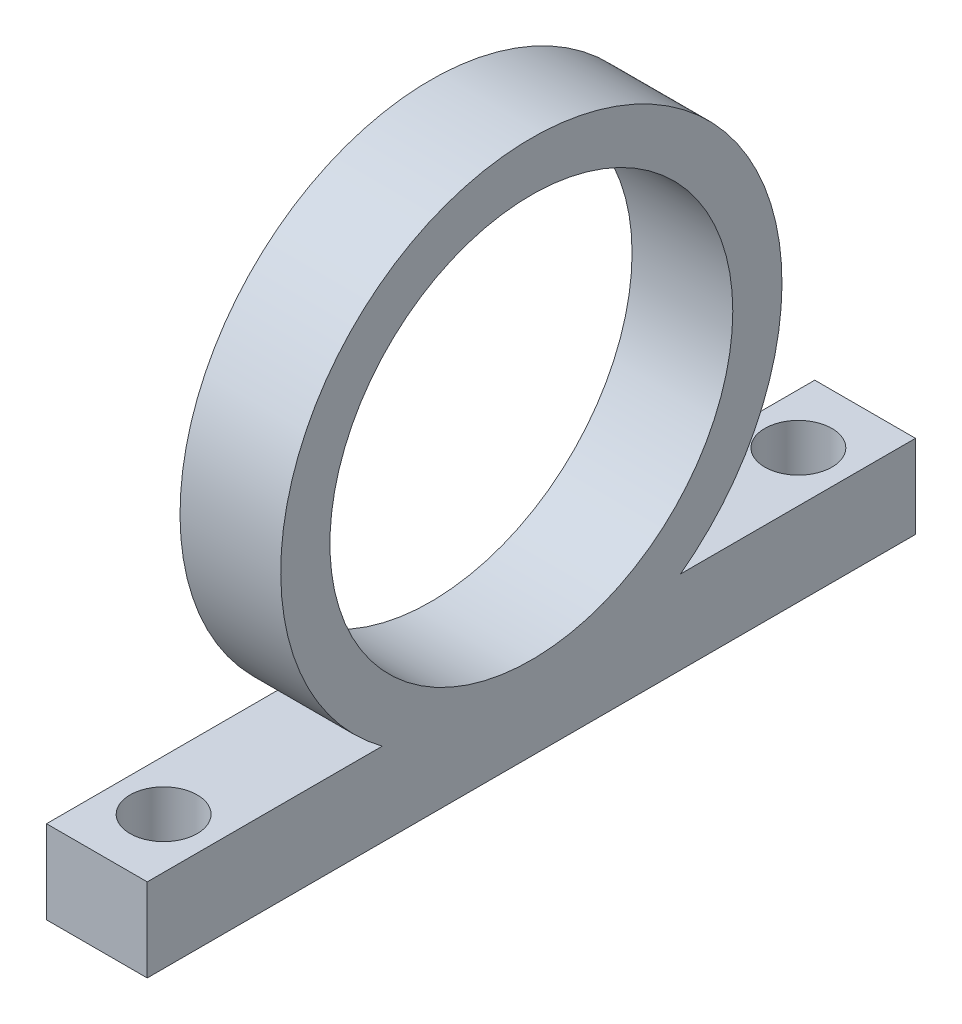
ISO-10303-21;
HEADER;
FILE_DESCRIPTION(('STEP AP214'),'2;1');
FILE_NAME('part.step','',(''),(''),'','','');
FILE_SCHEMA(('AUTOMOTIVE_DESIGN { 1 0 10303 214 1 1 1 1 }'));
ENDSEC;
DATA;
#1=APPLICATION_CONTEXT('core data for automotive mechanical design processes');
#2=APPLICATION_PROTOCOL_DEFINITION('international standard','automotive_design',2000,#1);
#3=PRODUCT_CONTEXT('',#1,'mechanical');
#4=PRODUCT('Part','Part','',(#3));
#5=PRODUCT_RELATED_PRODUCT_CATEGORY('part','',(#4));
#6=PRODUCT_DEFINITION_FORMATION('','',#4);
#7=PRODUCT_DEFINITION_CONTEXT('part definition',#1,'design');
#8=PRODUCT_DEFINITION('design','',#6,#7);
#9=PRODUCT_DEFINITION_SHAPE('','',#8);
#10=(LENGTH_UNIT() NAMED_UNIT(*) SI_UNIT(.MILLI.,.METRE.));
#11=(NAMED_UNIT(*) PLANE_ANGLE_UNIT() SI_UNIT($,.RADIAN.));
#12=(NAMED_UNIT(*) SI_UNIT($,.STERADIAN.) SOLID_ANGLE_UNIT());
#13=UNCERTAINTY_MEASURE_WITH_UNIT(LENGTH_MEASURE(1.E-05),#10,'distance_accuracy_value','');
#14=(GEOMETRIC_REPRESENTATION_CONTEXT(3) GLOBAL_UNCERTAINTY_ASSIGNED_CONTEXT((#13)) GLOBAL_UNIT_ASSIGNED_CONTEXT((#10,
#11,#12)) REPRESENTATION_CONTEXT('',''));
#15=CARTESIAN_POINT('',(0.,0.,0.));
#16=DIRECTION('',(0.,0.,1.));
#17=DIRECTION('',(1.,0.,0.));
#18=AXIS2_PLACEMENT_3D('',#15,#16,#17);
#19=CARTESIAN_POINT('',(30.,-84.8,0.));
#20=DIRECTION('',(0.,1.,0.));
#21=DIRECTION('',(0.,0.,1.));
#22=AXIS2_PLACEMENT_3D('',#19,#20,#21);
#23=PLANE('',#22);
#24=DIRECTION('',(0.,0.,-1.));
#25=VECTOR('',#24,1.);
#26=CARTESIAN_POINT('',(0.,-84.8,0.));
#27=LINE('',#26,#25);
#28=CARTESIAN_POINT('',(0.,-84.8,114.4142150668));
#29=VERTEX_POINT('',#28);
#30=CARTESIAN_POINT('',(0.,-84.8,-114.4142150668));
#31=VERTEX_POINT('',#30);
#32=EDGE_CURVE('E137',#29,#31,#27,.T.);
#33=ORIENTED_EDGE('',*,*,#32,.T.);
#34=DIRECTION('',(-1.,0.,0.));
#35=VECTOR('',#34,1.);
#36=CARTESIAN_POINT('',(30.,-84.8,-114.4142150668));
#37=LINE('',#36,#35);
#38=CARTESIAN_POINT('',(30.,-84.8,-114.4142150668));
#39=VERTEX_POINT('',#38);
#40=EDGE_CURVE('E72',#39,#31,#37,.T.);
#41=ORIENTED_EDGE('',*,*,#40,.F.);
#42=DIRECTION('',(0.,0.,-1.));
#43=VECTOR('',#42,1.);
#44=CARTESIAN_POINT('',(30.,-84.8,0.));
#45=LINE('',#44,#43);
#46=CARTESIAN_POINT('',(30.,-84.8,114.4142150668));
#47=VERTEX_POINT('',#46);
#48=EDGE_CURVE('E90',#47,#39,#45,.T.);
#49=ORIENTED_EDGE('',*,*,#48,.F.);
#50=DIRECTION('',(-1.,0.,0.));
#51=VECTOR('',#50,1.);
#52=CARTESIAN_POINT('',(30.,-84.8,114.4142150668));
#53=LINE('',#52,#51);
#54=EDGE_CURVE('E94',#47,#29,#53,.T.);
#55=ORIENTED_EDGE('',*,*,#54,.T.);
#56=EDGE_LOOP('',(#33,#41,#49,#55));
#57=FACE_BOUND('',#56,.T.);
#58=CARTESIAN_POINT('',(14.9999999999993,-84.8,-94.5321075334002));
#59=DIRECTION('',(0.,1.,0.));
#60=DIRECTION('',(0.,0.,1.));
#61=AXIS2_PLACEMENT_3D('',#58,#59,#60);
#62=CIRCLE('',#61,10.);
#63=CARTESIAN_POINT('',(14.9999999999993,-84.8,-84.5321075334002));
#64=VERTEX_POINT('',#63);
#65=EDGE_CURVE('E153',#64,#64,#62,.F.);
#66=ORIENTED_EDGE('',*,*,#65,.F.);
#67=EDGE_LOOP('',(#66));
#68=FACE_BOUND('',#67,.T.);
#69=CARTESIAN_POINT('',(14.9999999999993,-84.8,94.5321075334002));
#70=DIRECTION('',(0.,1.,0.));
#71=DIRECTION('',(0.,0.,1.));
#72=AXIS2_PLACEMENT_3D('',#69,#70,#71);
#73=CIRCLE('',#72,10.);
#74=CARTESIAN_POINT('',(14.9999999999993,-84.8000000000001,104.5321075334));
#75=VERTEX_POINT('',#74);
#76=EDGE_CURVE('E144',#75,#75,#73,.T.);
#77=ORIENTED_EDGE('',*,*,#76,.T.);
#78=EDGE_LOOP('',(#77));
#79=FACE_BOUND('',#78,.T.);
#80=ADVANCED_FACE('F35',(#57,#68,#79),#23,.F.);
#81=CARTESIAN_POINT('',(30.,-60.,0.));
#82=DIRECTION('',(0.,1.,0.));
#83=DIRECTION('',(0.,0.,1.));
#84=AXIS2_PLACEMENT_3D('',#81,#82,#83);
#85=PLANE('',#84);
#86=CARTESIAN_POINT('',(14.9999999999993,-60.,-94.5321075334002));
#87=DIRECTION('',(0.,1.,0.));
#88=DIRECTION('',(0.,0.,1.));
#89=AXIS2_PLACEMENT_3D('',#86,#87,#88);
#90=CIRCLE('',#89,10.);
#91=CARTESIAN_POINT('',(14.9999999999993,-60.,-84.5321075334002));
#92=VERTEX_POINT('',#91);
#93=EDGE_CURVE('E158',#92,#92,#90,.F.);
#94=ORIENTED_EDGE('',*,*,#93,.T.);
#95=EDGE_LOOP('',(#94));
#96=FACE_BOUND('',#95,.T.);
#97=DIRECTION('',(0.,0.,-1.));
#98=VECTOR('',#97,1.);
#99=CARTESIAN_POINT('',(0.,-60.,0.));
#100=LINE('',#99,#98);
#101=CARTESIAN_POINT('',(0.,-60.,-44.4142150668004));
#102=VERTEX_POINT('',#101);
#103=CARTESIAN_POINT('',(0.,-60.,-114.4142150668));
#104=VERTEX_POINT('',#103);
#105=EDGE_CURVE('E129',#102,#104,#100,.T.);
#106=ORIENTED_EDGE('',*,*,#105,.F.);
#107=DIRECTION('',(-1.,0.,0.));
#108=VECTOR('',#107,1.);
#109=CARTESIAN_POINT('',(30.,-60.,-44.4142150668004));
#110=LINE('',#109,#108);
#111=CARTESIAN_POINT('',(30.,-60.,-44.4142150668004));
#112=VERTEX_POINT('',#111);
#113=EDGE_CURVE('E11',#112,#102,#110,.T.);
#114=ORIENTED_EDGE('',*,*,#113,.F.);
#115=DIRECTION('',(0.,0.,-1.));
#116=VECTOR('',#115,1.);
#117=CARTESIAN_POINT('',(30.,-60.,0.));
#118=LINE('',#117,#116);
#119=CARTESIAN_POINT('',(30.,-60.,-114.4142150668));
#120=VERTEX_POINT('',#119);
#121=EDGE_CURVE('E163',#112,#120,#118,.T.);
#122=ORIENTED_EDGE('',*,*,#121,.T.);
#123=DIRECTION('',(-1.,0.,0.));
#124=VECTOR('',#123,1.);
#125=CARTESIAN_POINT('',(30.,-60.,-114.4142150668));
#126=LINE('',#125,#124);
#127=EDGE_CURVE('E52',#120,#104,#126,.T.);
#128=ORIENTED_EDGE('',*,*,#127,.T.);
#129=EDGE_LOOP('',(#106,#114,#122,#128));
#130=FACE_BOUND('',#129,.T.);
#131=ADVANCED_FACE('F167',(#96,#130),#85,.T.);
#132=CARTESIAN_POINT('',(30.,0.,0.));
#133=DIRECTION('',(-1.,0.,0.));
#134=DIRECTION('',(0.,0.,1.));
#135=AXIS2_PLACEMENT_3D('',#132,#133,#134);
#136=CYLINDRICAL_SURFACE('',#135,74.65);
#137=CARTESIAN_POINT('',(0.,0.,0.));
#138=DIRECTION('',(1.,0.,0.));
#139=DIRECTION('',(0.,0.,-1.));
#140=AXIS2_PLACEMENT_3D('',#137,#138,#139);
#141=CIRCLE('',#140,74.65);
#142=CARTESIAN_POINT('',(0.,-60.,44.4142150668004));
#143=VERTEX_POINT('',#142);
#144=EDGE_CURVE('E126',#102,#143,#141,.T.);
#145=ORIENTED_EDGE('',*,*,#144,.T.);
#146=DIRECTION('',(-1.,0.,0.));
#147=VECTOR('',#146,1.);
#148=CARTESIAN_POINT('',(30.,-60.,44.4142150668004));
#149=LINE('',#148,#147);
#150=CARTESIAN_POINT('',(30.,-60.,44.4142150668004));
#151=VERTEX_POINT('',#150);
#152=EDGE_CURVE('E44',#151,#143,#149,.T.);
#153=ORIENTED_EDGE('',*,*,#152,.F.);
#154=CARTESIAN_POINT('',(30.,0.,0.));
#155=DIRECTION('',(1.,0.,0.));
#156=DIRECTION('',(0.,0.,-1.));
#157=AXIS2_PLACEMENT_3D('',#154,#155,#156);
#158=CIRCLE('',#157,74.65);
#159=EDGE_CURVE('E165',#112,#151,#158,.T.);
#160=ORIENTED_EDGE('',*,*,#159,.F.);
#161=ORIENTED_EDGE('',*,*,#113,.T.);
#162=EDGE_LOOP('',(#145,#153,#160,#161));
#163=FACE_BOUND('',#162,.T.);
#164=ADVANCED_FACE('F127',(#163),#136,.T.);
#165=CARTESIAN_POINT('',(30.,-60.,0.));
#166=DIRECTION('',(0.,-1.,0.));
#167=DIRECTION('',(0.,0.,-1.));
#168=AXIS2_PLACEMENT_3D('',#165,#166,#167);
#169=PLANE('',#168);
#170=CARTESIAN_POINT('',(14.9999999999993,-60.,94.5321075334002));
#171=DIRECTION('',(0.,1.,0.));
#172=DIRECTION('',(0.,0.,1.));
#173=AXIS2_PLACEMENT_3D('',#170,#171,#172);
#174=CIRCLE('',#173,10.);
#175=CARTESIAN_POINT('',(14.9999999999993,-60.,104.5321075334));
#176=VERTEX_POINT('',#175);
#177=EDGE_CURVE('E148',#176,#176,#174,.T.);
#178=ORIENTED_EDGE('',*,*,#177,.F.);
#179=EDGE_LOOP('',(#178));
#180=FACE_BOUND('',#179,.T.);
#181=DIRECTION('',(0.,0.,1.));
#182=VECTOR('',#181,1.);
#183=CARTESIAN_POINT('',(0.,-60.,0.));
#184=LINE('',#183,#182);
#185=CARTESIAN_POINT('',(0.,-60.,114.4142150668));
#186=VERTEX_POINT('',#185);
#187=EDGE_CURVE('E123',#143,#186,#184,.T.);
#188=ORIENTED_EDGE('',*,*,#187,.T.);
#189=DIRECTION('',(-1.,0.,0.));
#190=VECTOR('',#189,1.);
#191=CARTESIAN_POINT('',(30.,-60.,114.4142150668));
#192=LINE('',#191,#190);
#193=CARTESIAN_POINT('',(30.,-60.,114.4142150668));
#194=VERTEX_POINT('',#193);
#195=EDGE_CURVE('E112',#194,#186,#192,.T.);
#196=ORIENTED_EDGE('',*,*,#195,.F.);
#197=DIRECTION('',(0.,0.,1.));
#198=VECTOR('',#197,1.);
#199=CARTESIAN_POINT('',(30.,-60.,0.));
#200=LINE('',#199,#198);
#201=EDGE_CURVE('E105',#151,#194,#200,.T.);
#202=ORIENTED_EDGE('',*,*,#201,.F.);
#203=ORIENTED_EDGE('',*,*,#152,.T.);
#204=EDGE_LOOP('',(#188,#196,#202,#203));
#205=FACE_BOUND('',#204,.T.);
#206=ADVANCED_FACE('F122',(#180,#205),#169,.F.);
#207=CARTESIAN_POINT('',(30.,1.2804969345925E-13,114.4142150668));
#208=DIRECTION('',(0.,0.,-1.));
#209=DIRECTION('',(0.,1.,0.));
#210=AXIS2_PLACEMENT_3D('',#207,#208,#209);
#211=PLANE('',#210);
#212=DIRECTION('',(0.,-1.,0.));
#213=VECTOR('',#212,1.);
#214=CARTESIAN_POINT('',(0.,1.2804969345925E-13,114.4142150668));
#215=LINE('',#214,#213);
#216=EDGE_CURVE('E111',#186,#29,#215,.T.);
#217=ORIENTED_EDGE('',*,*,#216,.T.);
#218=ORIENTED_EDGE('',*,*,#54,.F.);
#219=DIRECTION('',(0.,-1.,0.));
#220=VECTOR('',#219,1.);
#221=CARTESIAN_POINT('',(30.,1.2804969345925E-13,114.4142150668));
#222=LINE('',#221,#220);
#223=EDGE_CURVE('E99',#194,#47,#222,.T.);
#224=ORIENTED_EDGE('',*,*,#223,.F.);
#225=ORIENTED_EDGE('',*,*,#195,.T.);
#226=EDGE_LOOP('',(#217,#218,#224,#225));
#227=FACE_BOUND('',#226,.T.);
#228=ADVANCED_FACE('F110',(#227),#211,.F.);
#229=CARTESIAN_POINT('',(30.,0.,0.));
#230=DIRECTION('',(-1.,0.,0.));
#231=DIRECTION('',(0.,0.,1.));
#232=AXIS2_PLACEMENT_3D('',#229,#230,#231);
#233=CYLINDRICAL_SURFACE('',#232,60.);
#234=CARTESIAN_POINT('',(30.,0.,0.));
#235=DIRECTION('',(1.,0.,0.));
#236=DIRECTION('',(0.,0.,-1.));
#237=AXIS2_PLACEMENT_3D('',#234,#235,#236);
#238=CIRCLE('',#237,60.);
#239=CARTESIAN_POINT('',(30.,0.,-60.));
#240=VERTEX_POINT('',#239);
#241=EDGE_CURVE('E141',#240,#240,#238,.T.);
#242=ORIENTED_EDGE('',*,*,#241,.T.);
#243=EDGE_LOOP('',(#242));
#244=FACE_BOUND('',#243,.T.);
#245=CARTESIAN_POINT('',(0.,0.,0.));
#246=DIRECTION('',(1.,0.,0.));
#247=DIRECTION('',(0.,0.,-1.));
#248=AXIS2_PLACEMENT_3D('',#245,#246,#247);
#249=CIRCLE('',#248,60.);
#250=CARTESIAN_POINT('',(0.,0.,-60.));
#251=VERTEX_POINT('',#250);
#252=EDGE_CURVE('E132',#251,#251,#249,.T.);
#253=ORIENTED_EDGE('',*,*,#252,.F.);
#254=EDGE_LOOP('',(#253));
#255=FACE_BOUND('',#254,.T.);
#256=ADVANCED_FACE('F37',(#244,#255),#233,.F.);
#257=CARTESIAN_POINT('',(30.,0.,-114.4142150668));
#258=DIRECTION('',(0.,0.,-1.));
#259=DIRECTION('',(-1.,0.,0.));
#260=AXIS2_PLACEMENT_3D('',#257,#258,#259);
#261=PLANE('',#260);
#262=DIRECTION('',(0.,-1.,0.));
#263=VECTOR('',#262,1.);
#264=CARTESIAN_POINT('',(0.,0.,-114.4142150668));
#265=LINE('',#264,#263);
#266=EDGE_CURVE('E139',#104,#31,#265,.T.);
#267=ORIENTED_EDGE('',*,*,#266,.F.);
#268=ORIENTED_EDGE('',*,*,#127,.F.);
#269=DIRECTION('',(0.,-1.,0.));
#270=VECTOR('',#269,1.);
#271=CARTESIAN_POINT('',(30.,0.,-114.4142150668));
#272=LINE('',#271,#270);
#273=EDGE_CURVE('E98',#120,#39,#272,.T.);
#274=ORIENTED_EDGE('',*,*,#273,.T.);
#275=ORIENTED_EDGE('',*,*,#40,.T.);
#276=EDGE_LOOP('',(#267,#268,#274,#275));
#277=FACE_BOUND('',#276,.T.);
#278=ADVANCED_FACE('F182',(#277),#261,.T.);
#279=CARTESIAN_POINT('',(30.,0.,0.));
#280=DIRECTION('',(1.,0.,0.));
#281=DIRECTION('',(0.,0.,-1.));
#282=AXIS2_PLACEMENT_3D('',#279,#280,#281);
#283=PLANE('',#282);
#284=ORIENTED_EDGE('',*,*,#241,.F.);
#285=EDGE_LOOP('',(#284));
#286=FACE_BOUND('',#285,.T.);
#287=ORIENTED_EDGE('',*,*,#121,.F.);
#288=ORIENTED_EDGE('',*,*,#159,.T.);
#289=ORIENTED_EDGE('',*,*,#201,.T.);
#290=ORIENTED_EDGE('',*,*,#223,.T.);
#291=ORIENTED_EDGE('',*,*,#48,.T.);
#292=ORIENTED_EDGE('',*,*,#273,.F.);
#293=EDGE_LOOP('',(#287,#288,#289,#290,#291,#292));
#294=FACE_BOUND('',#293,.T.);
#295=ADVANCED_FACE('F103',(#286,#294),#283,.T.);
#296=CARTESIAN_POINT('',(0.,0.,0.));
#297=DIRECTION('',(1.,0.,0.));
#298=DIRECTION('',(0.,0.,-1.));
#299=AXIS2_PLACEMENT_3D('',#296,#297,#298);
#300=PLANE('',#299);
#301=ORIENTED_EDGE('',*,*,#252,.T.);
#302=EDGE_LOOP('',(#301));
#303=FACE_BOUND('',#302,.T.);
#304=ORIENTED_EDGE('',*,*,#105,.T.);
#305=ORIENTED_EDGE('',*,*,#266,.T.);
#306=ORIENTED_EDGE('',*,*,#32,.F.);
#307=ORIENTED_EDGE('',*,*,#216,.F.);
#308=ORIENTED_EDGE('',*,*,#187,.F.);
#309=ORIENTED_EDGE('',*,*,#144,.F.);
#310=EDGE_LOOP('',(#304,#305,#306,#307,#308,#309));
#311=FACE_BOUND('',#310,.T.);
#312=ADVANCED_FACE('F185',(#303,#311),#300,.F.);
#313=CARTESIAN_POINT('',(14.9999999999993,-84.8,-94.5321075334002));
#314=DIRECTION('',(0.,1.,0.));
#315=DIRECTION('',(0.,0.,1.));
#316=AXIS2_PLACEMENT_3D('',#313,#314,#315);
#317=CYLINDRICAL_SURFACE('',#316,10.);
#318=CARTESIAN_POINT('',(14.9999999999993,-84.8,-84.5321075334002));
#319=CARTESIAN_POINT('',(14.9999999999993,-84.5416666666667,-84.5321075334002));
#320=CARTESIAN_POINT('',(14.9999999999993,-84.2833333333333,-84.5321075334002));
#321=CARTESIAN_POINT('',(14.9999999999993,-83.7666666666667,-84.5321075334002));
#322=CARTESIAN_POINT('',(14.9999999999993,-83.5083333333334,-84.5321075334002));
#323=CARTESIAN_POINT('',(14.9999999999993,-82.9916666666667,-84.5321075334002));
#324=CARTESIAN_POINT('',(14.9999999999993,-82.7333333333333,-84.5321075334002));
#325=CARTESIAN_POINT('',(14.9999999999993,-82.2166666666667,-84.5321075334002));
#326=CARTESIAN_POINT('',(14.9999999999993,-81.9583333333334,-84.5321075334002));
#327=CARTESIAN_POINT('',(14.9999999999993,-81.4416666666667,-84.5321075334002));
#328=CARTESIAN_POINT('',(14.9999999999993,-81.1833333333333,-84.5321075334002));
#329=CARTESIAN_POINT('',(14.9999999999993,-80.6666666666667,-84.5321075334002));
#330=CARTESIAN_POINT('',(14.9999999999993,-80.4083333333333,-84.5321075334002));
#331=CARTESIAN_POINT('',(14.9999999999993,-79.8916666666667,-84.5321075334002));
#332=CARTESIAN_POINT('',(14.9999999999993,-79.6333333333334,-84.5321075334002));
#333=CARTESIAN_POINT('',(14.9999999999993,-79.1166666666667,-84.5321075334002));
#334=CARTESIAN_POINT('',(14.9999999999993,-78.8583333333333,-84.5321075334002));
#335=CARTESIAN_POINT('',(14.9999999999993,-78.3416666666667,-84.5321075334002));
#336=CARTESIAN_POINT('',(14.9999999999993,-78.0833333333334,-84.5321075334002));
#337=CARTESIAN_POINT('',(14.9999999999993,-77.5666666666667,-84.5321075334002));
#338=CARTESIAN_POINT('',(14.9999999999993,-77.3083333333333,-84.5321075334002));
#339=CARTESIAN_POINT('',(14.9999999999993,-76.7916666666667,-84.5321075334002));
#340=CARTESIAN_POINT('',(14.9999999999993,-76.5333333333333,-84.5321075334002));
#341=CARTESIAN_POINT('',(14.9999999999993,-76.0166666666667,-84.5321075334002));
#342=CARTESIAN_POINT('',(14.9999999999993,-75.7583333333333,-84.5321075334002));
#343=CARTESIAN_POINT('',(14.9999999999993,-75.2416666666667,-84.5321075334002));
#344=CARTESIAN_POINT('',(14.9999999999993,-74.9833333333333,-84.5321075334002));
#345=CARTESIAN_POINT('',(14.9999999999993,-74.4666666666667,-84.5321075334002));
#346=CARTESIAN_POINT('',(14.9999999999993,-74.2083333333333,-84.5321075334002));
#347=CARTESIAN_POINT('',(14.9999999999993,-73.6916666666667,-84.5321075334002));
#348=CARTESIAN_POINT('',(14.9999999999993,-73.4333333333333,-84.5321075334002));
#349=CARTESIAN_POINT('',(14.9999999999993,-72.9166666666667,-84.5321075334002));
#350=CARTESIAN_POINT('',(14.9999999999993,-72.6583333333333,-84.5321075334002));
#351=CARTESIAN_POINT('',(14.9999999999993,-72.1416666666667,-84.5321075334002));
#352=CARTESIAN_POINT('',(14.9999999999993,-71.8833333333333,-84.5321075334002));
#353=CARTESIAN_POINT('',(14.9999999999993,-71.3666666666667,-84.5321075334002));
#354=CARTESIAN_POINT('',(14.9999999999993,-71.1083333333333,-84.5321075334002));
#355=CARTESIAN_POINT('',(14.9999999999993,-70.5916666666667,-84.5321075334002));
#356=CARTESIAN_POINT('',(14.9999999999993,-70.3333333333333,-84.5321075334002));
#357=CARTESIAN_POINT('',(14.9999999999993,-69.8166666666667,-84.5321075334002));
#358=CARTESIAN_POINT('',(14.9999999999993,-69.5583333333333,-84.5321075334002));
#359=CARTESIAN_POINT('',(14.9999999999993,-69.0416666666667,-84.5321075334002));
#360=CARTESIAN_POINT('',(14.9999999999993,-68.7833333333333,-84.5321075334002));
#361=CARTESIAN_POINT('',(14.9999999999993,-68.2666666666667,-84.5321075334002));
#362=CARTESIAN_POINT('',(14.9999999999993,-68.0083333333333,-84.5321075334002));
#363=CARTESIAN_POINT('',(14.9999999999993,-67.4916666666667,-84.5321075334002));
#364=CARTESIAN_POINT('',(14.9999999999993,-67.2333333333333,-84.5321075334002));
#365=CARTESIAN_POINT('',(14.9999999999993,-66.7166666666667,-84.5321075334002));
#366=CARTESIAN_POINT('',(14.9999999999993,-66.4583333333333,-84.5321075334002));
#367=CARTESIAN_POINT('',(14.9999999999993,-65.9416666666667,-84.5321075334002));
#368=CARTESIAN_POINT('',(14.9999999999993,-65.6833333333333,-84.5321075334002));
#369=CARTESIAN_POINT('',(14.9999999999993,-65.1666666666667,-84.5321075334002));
#370=CARTESIAN_POINT('',(14.9999999999993,-64.9083333333333,-84.5321075334002));
#371=CARTESIAN_POINT('',(14.9999999999993,-64.3916666666667,-84.5321075334002));
#372=CARTESIAN_POINT('',(14.9999999999993,-64.1333333333333,-84.5321075334002));
#373=CARTESIAN_POINT('',(14.9999999999993,-63.6166666666667,-84.5321075334002));
#374=CARTESIAN_POINT('',(14.9999999999993,-63.3583333333333,-84.5321075334002));
#375=CARTESIAN_POINT('',(14.9999999999993,-62.8416666666667,-84.5321075334002));
#376=CARTESIAN_POINT('',(14.9999999999993,-62.5833333333333,-84.5321075334002));
#377=CARTESIAN_POINT('',(14.9999999999993,-62.0666666666667,-84.5321075334002));
#378=CARTESIAN_POINT('',(14.9999999999993,-61.8083333333333,-84.5321075334002));
#379=CARTESIAN_POINT('',(14.9999999999993,-61.2916666666667,-84.5321075334002));
#380=CARTESIAN_POINT('',(14.9999999999993,-61.0333333333333,-84.5321075334002));
#381=CARTESIAN_POINT('',(14.9999999999993,-60.5166666666667,-84.5321075334002));
#382=CARTESIAN_POINT('',(14.9999999999993,-60.2583333333333,-84.5321075334002));
#383=CARTESIAN_POINT('',(14.9999999999993,-60.,-84.5321075334002));
#384=B_SPLINE_CURVE_WITH_KNOTS('',3,(#318,#319,#320,#321,#322,#323,#324,#325,#326,#327,#328,
#329,#330,#331,#332,#333,#334,#335,#336,#337,#338,#339,#340,#341,#342,#343,#344,#345,#346,#347,
#348,#349,#350,#351,#352,#353,#354,#355,#356,#357,#358,#359,#360,#361,#362,#363,#364,#365,#366,
#367,#368,#369,#370,#371,#372,#373,#374,#375,#376,#377,#378,#379,#380,#381,#382,#383),
.UNSPECIFIED.,.F.,.F.,(4,2,2,2,2,2,2,2,2,2,2,2,2,2,2,2,2,2,2,2,2,2,2,2,2,2,2,2,2,2,2,2,4),(0.,
0.775000000000012,1.55000000000001,2.32500000000001,3.10000000000001,3.87500000000002,
4.65000000000002,5.42500000000001,6.20000000000001,6.97500000000001,7.75000000000002,
8.52500000000002,9.30000000000002,10.075,10.85,11.625,12.4,13.175,13.95,14.725,15.5,16.275,
17.05,17.825,18.6,19.375,20.15,20.925,21.7,22.475,23.25,24.025,24.8),.UNSPECIFIED.);
#385=EDGE_CURVE('BSEAM188',#64,#92,#384,.T.);
#386=ORIENTED_EDGE('',*,*,#65,.T.);
#387=ORIENTED_EDGE('',*,*,#93,.F.);
#388=ORIENTED_EDGE('',*,*,#385,.T.);
#389=ORIENTED_EDGE('',*,*,#385,.F.);
#390=EDGE_LOOP('',(#386,#388,#387,#389));
#391=FACE_BOUND('',#390,.T.);
#392=ADVANCED_FACE('F188',(#391),#317,.F.);
#393=CARTESIAN_POINT('',(14.9999999999993,-84.8,94.5321075334002));
#394=DIRECTION('',(0.,1.,0.));
#395=DIRECTION('',(0.,0.,1.));
#396=AXIS2_PLACEMENT_3D('',#393,#394,#395);
#397=CYLINDRICAL_SURFACE('',#396,10.);
#398=CARTESIAN_POINT('',(14.9999999999993,-84.8000000000001,104.5321075334));
#399=CARTESIAN_POINT('',(14.9999999999993,-84.5416666666667,104.5321075334));
#400=CARTESIAN_POINT('',(14.9999999999993,-84.2833333333334,104.5321075334));
#401=CARTESIAN_POINT('',(14.9999999999993,-83.7666666666667,104.5321075334));
#402=CARTESIAN_POINT('',(14.9999999999993,-83.5083333333334,104.5321075334));
#403=CARTESIAN_POINT('',(14.9999999999993,-82.9916666666667,104.5321075334));
#404=CARTESIAN_POINT('',(14.9999999999993,-82.7333333333334,104.5321075334));
#405=CARTESIAN_POINT('',(14.9999999999993,-82.2166666666667,104.5321075334));
#406=CARTESIAN_POINT('',(14.9999999999993,-81.9583333333334,104.5321075334));
#407=CARTESIAN_POINT('',(14.9999999999993,-81.4416666666667,104.5321075334));
#408=CARTESIAN_POINT('',(14.9999999999993,-81.1833333333334,104.5321075334));
#409=CARTESIAN_POINT('',(14.9999999999993,-80.6666666666667,104.5321075334));
#410=CARTESIAN_POINT('',(14.9999999999993,-80.4083333333334,104.5321075334));
#411=CARTESIAN_POINT('',(14.9999999999993,-79.8916666666667,104.5321075334));
#412=CARTESIAN_POINT('',(14.9999999999993,-79.6333333333334,104.5321075334));
#413=CARTESIAN_POINT('',(14.9999999999993,-79.1166666666667,104.5321075334));
#414=CARTESIAN_POINT('',(14.9999999999993,-78.8583333333334,104.5321075334));
#415=CARTESIAN_POINT('',(14.9999999999993,-78.3416666666667,104.5321075334));
#416=CARTESIAN_POINT('',(14.9999999999993,-78.0833333333334,104.5321075334));
#417=CARTESIAN_POINT('',(14.9999999999993,-77.5666666666667,104.5321075334));
#418=CARTESIAN_POINT('',(14.9999999999993,-77.3083333333334,104.5321075334));
#419=CARTESIAN_POINT('',(14.9999999999993,-76.7916666666667,104.5321075334));
#420=CARTESIAN_POINT('',(14.9999999999993,-76.5333333333334,104.5321075334));
#421=CARTESIAN_POINT('',(14.9999999999993,-76.0166666666667,104.5321075334));
#422=CARTESIAN_POINT('',(14.9999999999993,-75.7583333333334,104.5321075334));
#423=CARTESIAN_POINT('',(14.9999999999993,-75.2416666666667,104.5321075334));
#424=CARTESIAN_POINT('',(14.9999999999993,-74.9833333333334,104.5321075334));
#425=CARTESIAN_POINT('',(14.9999999999993,-74.4666666666667,104.5321075334));
#426=CARTESIAN_POINT('',(14.9999999999993,-74.2083333333334,104.5321075334));
#427=CARTESIAN_POINT('',(14.9999999999993,-73.6916666666667,104.5321075334));
#428=CARTESIAN_POINT('',(14.9999999999993,-73.4333333333334,104.5321075334));
#429=CARTESIAN_POINT('',(14.9999999999993,-72.9166666666667,104.5321075334));
#430=CARTESIAN_POINT('',(14.9999999999993,-72.6583333333334,104.5321075334));
#431=CARTESIAN_POINT('',(14.9999999999993,-72.1416666666667,104.5321075334));
#432=CARTESIAN_POINT('',(14.9999999999993,-71.8833333333334,104.5321075334));
#433=CARTESIAN_POINT('',(14.9999999999993,-71.3666666666667,104.5321075334));
#434=CARTESIAN_POINT('',(14.9999999999993,-71.1083333333334,104.5321075334));
#435=CARTESIAN_POINT('',(14.9999999999993,-70.5916666666667,104.5321075334));
#436=CARTESIAN_POINT('',(14.9999999999993,-70.3333333333334,104.5321075334));
#437=CARTESIAN_POINT('',(14.9999999999993,-69.8166666666667,104.5321075334));
#438=CARTESIAN_POINT('',(14.9999999999993,-69.5583333333334,104.5321075334));
#439=CARTESIAN_POINT('',(14.9999999999993,-69.0416666666667,104.5321075334));
#440=CARTESIAN_POINT('',(14.9999999999993,-68.7833333333334,104.5321075334));
#441=CARTESIAN_POINT('',(14.9999999999993,-68.2666666666667,104.5321075334));
#442=CARTESIAN_POINT('',(14.9999999999993,-68.0083333333334,104.5321075334));
#443=CARTESIAN_POINT('',(14.9999999999993,-67.4916666666667,104.5321075334));
#444=CARTESIAN_POINT('',(14.9999999999993,-67.2333333333333,104.5321075334));
#445=CARTESIAN_POINT('',(14.9999999999993,-66.7166666666667,104.5321075334));
#446=CARTESIAN_POINT('',(14.9999999999993,-66.4583333333334,104.5321075334));
#447=CARTESIAN_POINT('',(14.9999999999993,-65.9416666666667,104.5321075334));
#448=CARTESIAN_POINT('',(14.9999999999993,-65.6833333333333,104.5321075334));
#449=CARTESIAN_POINT('',(14.9999999999993,-65.1666666666667,104.5321075334));
#450=CARTESIAN_POINT('',(14.9999999999993,-64.9083333333333,104.5321075334));
#451=CARTESIAN_POINT('',(14.9999999999993,-64.3916666666667,104.5321075334));
#452=CARTESIAN_POINT('',(14.9999999999993,-64.1333333333334,104.5321075334));
#453=CARTESIAN_POINT('',(14.9999999999993,-63.6166666666667,104.5321075334));
#454=CARTESIAN_POINT('',(14.9999999999993,-63.3583333333333,104.5321075334));
#455=CARTESIAN_POINT('',(14.9999999999993,-62.8416666666667,104.5321075334));
#456=CARTESIAN_POINT('',(14.9999999999993,-62.5833333333333,104.5321075334));
#457=CARTESIAN_POINT('',(14.9999999999993,-62.0666666666667,104.5321075334));
#458=CARTESIAN_POINT('',(14.9999999999993,-61.8083333333333,104.5321075334));
#459=CARTESIAN_POINT('',(14.9999999999993,-61.2916666666667,104.5321075334));
#460=CARTESIAN_POINT('',(14.9999999999993,-61.0333333333333,104.5321075334));
#461=CARTESIAN_POINT('',(14.9999999999993,-60.5166666666667,104.5321075334));
#462=CARTESIAN_POINT('',(14.9999999999993,-60.2583333333333,104.5321075334));
#463=CARTESIAN_POINT('',(14.9999999999993,-60.,104.5321075334));
#464=B_SPLINE_CURVE_WITH_KNOTS('',3,(#398,#399,#400,#401,#402,#403,#404,#405,#406,#407,#408,
#409,#410,#411,#412,#413,#414,#415,#416,#417,#418,#419,#420,#421,#422,#423,#424,#425,#426,#427,
#428,#429,#430,#431,#432,#433,#434,#435,#436,#437,#438,#439,#440,#441,#442,#443,#444,#445,#446,
#447,#448,#449,#450,#451,#452,#453,#454,#455,#456,#457,#458,#459,#460,#461,#462,#463),
.UNSPECIFIED.,.F.,.F.,(4,2,2,2,2,2,2,2,2,2,2,2,2,2,2,2,2,2,2,2,2,2,2,2,2,2,2,2,2,2,2,2,4),(0.,
0.775000000000012,1.55000000000001,2.32500000000001,3.10000000000001,3.87500000000002,
4.65000000000002,5.42500000000001,6.20000000000001,6.97500000000002,7.75000000000002,
8.52500000000002,9.30000000000002,10.075,10.85,11.625,12.4,13.175,13.95,14.725,15.5,16.275,
17.05,17.825,18.6,19.375,20.15,20.925,21.7,22.475,23.25,24.025,24.8),.UNSPECIFIED.);
#465=EDGE_CURVE('BSEAM194',#75,#176,#464,.T.);
#466=ORIENTED_EDGE('',*,*,#76,.F.);
#467=ORIENTED_EDGE('',*,*,#177,.T.);
#468=ORIENTED_EDGE('',*,*,#465,.T.);
#469=ORIENTED_EDGE('',*,*,#465,.F.);
#470=EDGE_LOOP('',(#466,#468,#467,#469));
#471=FACE_BOUND('',#470,.T.);
#472=ADVANCED_FACE('F194',(#471),#397,.F.);
#473=CLOSED_SHELL('',(#80,#131,#164,#206,#228,#256,#278,#295,#312,#392,#472));
#474=MANIFOLD_SOLID_BREP('B2',#473);
#475=ADVANCED_BREP_SHAPE_REPRESENTATION('',(#18,#474),#14);
#476=SHAPE_DEFINITION_REPRESENTATION(#9,#475);
ENDSEC;
END-ISO-10303-21;
